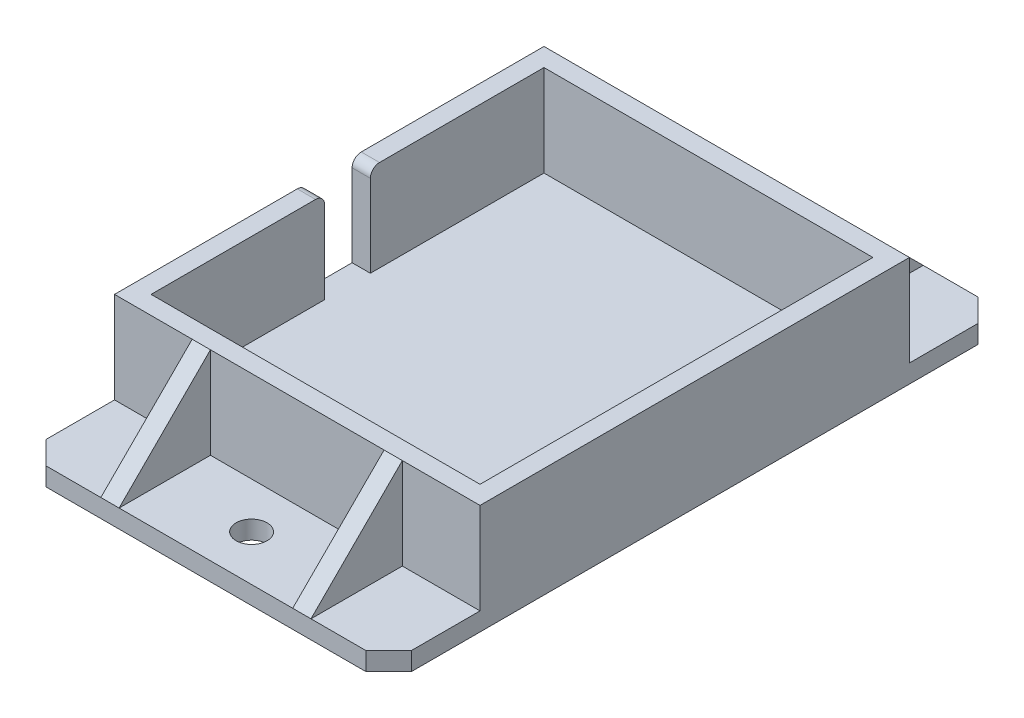
ISO-10303-21;
HEADER;
FILE_DESCRIPTION(('STEP AP214'),'2;1');
FILE_NAME('part.step','',(''),(''),'','','');
FILE_SCHEMA(('AUTOMOTIVE_DESIGN { 1 0 10303 214 1 1 1 1 }'));
ENDSEC;
DATA;
#1=APPLICATION_CONTEXT('core data for automotive mechanical design processes');
#2=APPLICATION_PROTOCOL_DEFINITION('international standard','automotive_design',2000,#1);
#3=PRODUCT_CONTEXT('',#1,'mechanical');
#4=PRODUCT('Part','Part','',(#3));
#5=PRODUCT_RELATED_PRODUCT_CATEGORY('part','',(#4));
#6=PRODUCT_DEFINITION_FORMATION('','',#4);
#7=PRODUCT_DEFINITION_CONTEXT('part definition',#1,'design');
#8=PRODUCT_DEFINITION('design','',#6,#7);
#9=PRODUCT_DEFINITION_SHAPE('','',#8);
#10=(LENGTH_UNIT() NAMED_UNIT(*) SI_UNIT(.MILLI.,.METRE.));
#11=(NAMED_UNIT(*) PLANE_ANGLE_UNIT() SI_UNIT($,.RADIAN.));
#12=(NAMED_UNIT(*) SI_UNIT($,.STERADIAN.) SOLID_ANGLE_UNIT());
#13=UNCERTAINTY_MEASURE_WITH_UNIT(LENGTH_MEASURE(1.E-05),#10,'distance_accuracy_value','');
#14=(GEOMETRIC_REPRESENTATION_CONTEXT(3) GLOBAL_UNCERTAINTY_ASSIGNED_CONTEXT((#13)) GLOBAL_UNIT_ASSIGNED_CONTEXT((#10,
#11,#12)) REPRESENTATION_CONTEXT('',''));
#15=CARTESIAN_POINT('',(0.,0.,0.));
#16=DIRECTION('',(0.,0.,1.));
#17=DIRECTION('',(1.,0.,0.));
#18=AXIS2_PLACEMENT_3D('',#15,#16,#17);
#19=CARTESIAN_POINT('',(-40.,20.,47.));
#20=DIRECTION('',(0.,0.,-1.));
#21=DIRECTION('',(-1.,0.,0.));
#22=AXIS2_PLACEMENT_3D('',#19,#20,#21);
#23=PLANE('',#22);
#24=DIRECTION('',(0.,-1.,0.));
#25=VECTOR('',#24,1.);
#26=CARTESIAN_POINT('',(19.,20.,47.));
#27=LINE('',#26,#25);
#28=CARTESIAN_POINT('',(19.,20.,47.));
#29=VERTEX_POINT('',#28);
#30=CARTESIAN_POINT('',(19.,0.,47.));
#31=VERTEX_POINT('',#30);
#32=EDGE_CURVE('E272',#29,#31,#27,.T.);
#33=ORIENTED_EDGE('',*,*,#32,.F.);
#34=DIRECTION('',(1.,0.,0.));
#35=VECTOR('',#34,1.);
#36=CARTESIAN_POINT('',(-40.,20.,47.));
#37=LINE('',#36,#35);
#38=CARTESIAN_POINT('',(-19.,20.,47.));
#39=VERTEX_POINT('',#38);
#40=EDGE_CURVE('E281',#39,#29,#37,.T.);
#41=ORIENTED_EDGE('',*,*,#40,.F.);
#42=DIRECTION('',(0.,1.,0.));
#43=VECTOR('',#42,1.);
#44=CARTESIAN_POINT('',(-19.,20.,47.));
#45=LINE('',#44,#43);
#46=CARTESIAN_POINT('',(-19.,0.,47.));
#47=VERTEX_POINT('',#46);
#48=EDGE_CURVE('E598',#47,#39,#45,.T.);
#49=ORIENTED_EDGE('',*,*,#48,.F.);
#50=DIRECTION('',(1.,0.,0.));
#51=VECTOR('',#50,1.);
#52=CARTESIAN_POINT('',(-40.,0.,47.));
#53=LINE('',#52,#51);
#54=EDGE_CURVE('E284',#47,#31,#53,.T.);
#55=ORIENTED_EDGE('',*,*,#54,.T.);
#56=EDGE_LOOP('',(#33,#41,#49,#55));
#57=FACE_BOUND('',#56,.T.);
#58=ADVANCED_FACE('F34',(#57),#23,.F.);
#59=CARTESIAN_POINT('',(0.,0.,0.));
#60=DIRECTION('',(0.,1.,0.));
#61=DIRECTION('',(0.,0.,1.));
#62=AXIS2_PLACEMENT_3D('',#59,#60,#61);
#63=PLANE('',#62);
#64=CARTESIAN_POINT('',(0.,0.,57.));
#65=DIRECTION('',(0.,1.,0.));
#66=DIRECTION('',(0.,0.,1.));
#67=AXIS2_PLACEMENT_3D('',#64,#65,#66);
#68=CIRCLE('',#67,3.4);
#69=CARTESIAN_POINT('',(0.,0.,60.4));
#70=VERTEX_POINT('',#69);
#71=EDGE_CURVE('E505',#70,#70,#68,.T.);
#72=ORIENTED_EDGE('',*,*,#71,.F.);
#73=EDGE_LOOP('',(#72));
#74=FACE_BOUND('',#73,.T.);
#75=DIRECTION('',(-1.,0.,0.));
#76=VECTOR('',#75,1.);
#77=CARTESIAN_POINT('',(-40.,0.,67.));
#78=LINE('',#77,#76);
#79=CARTESIAN_POINT('',(19.,0.,67.));
#80=VERTEX_POINT('',#79);
#81=CARTESIAN_POINT('',(-19.,0.,67.));
#82=VERTEX_POINT('',#81);
#83=EDGE_CURVE('E417',#80,#82,#78,.T.);
#84=ORIENTED_EDGE('',*,*,#83,.F.);
#85=DIRECTION('',(0.,0.,-1.));
#86=VECTOR('',#85,1.);
#87=CARTESIAN_POINT('',(19.,0.,0.));
#88=LINE('',#87,#86);
#89=EDGE_CURVE('E274',#80,#31,#88,.T.);
#90=ORIENTED_EDGE('',*,*,#89,.T.);
#91=ORIENTED_EDGE('',*,*,#54,.F.);
#92=DIRECTION('',(0.,0.,1.));
#93=VECTOR('',#92,1.);
#94=CARTESIAN_POINT('',(-19.,0.,0.));
#95=LINE('',#94,#93);
#96=EDGE_CURVE('E600',#47,#82,#95,.T.);
#97=ORIENTED_EDGE('',*,*,#96,.T.);
#98=EDGE_LOOP('',(#84,#90,#91,#97));
#99=FACE_BOUND('',#98,.T.);
#100=ADVANCED_FACE('F612',(#74,#99),#63,.T.);
#101=CARTESIAN_POINT('',(23.,20.,47.));
#102=VERTEX_POINT('',#101);
#103=CARTESIAN_POINT('',(40.,20.,47.));
#104=VERTEX_POINT('',#103);
#105=EDGE_CURVE('E292',#102,#104,#37,.T.);
#106=ORIENTED_EDGE('',*,*,#105,.F.);
#107=DIRECTION('',(0.,-1.,0.));
#108=VECTOR('',#107,1.);
#109=CARTESIAN_POINT('',(23.,20.,47.));
#110=LINE('',#109,#108);
#111=CARTESIAN_POINT('',(23.,0.,47.));
#112=VERTEX_POINT('',#111);
#113=EDGE_CURVE('E267',#102,#112,#110,.T.);
#114=ORIENTED_EDGE('',*,*,#113,.T.);
#115=CARTESIAN_POINT('',(40.,0.,47.));
#116=VERTEX_POINT('',#115);
#117=EDGE_CURVE('E310',#112,#116,#53,.T.);
#118=ORIENTED_EDGE('',*,*,#117,.T.);
#119=DIRECTION('',(0.,-1.,0.));
#120=VECTOR('',#119,1.);
#121=CARTESIAN_POINT('',(40.,20.,47.));
#122=LINE('',#121,#120);
#123=EDGE_CURVE('E321',#104,#116,#122,.T.);
#124=ORIENTED_EDGE('',*,*,#123,.F.);
#125=EDGE_LOOP('',(#106,#114,#118,#124));
#126=FACE_BOUND('',#125,.T.);
#127=ADVANCED_FACE('F461',(#126),#23,.F.);
#128=CARTESIAN_POINT('',(35.,0.,67.));
#129=VERTEX_POINT('',#128);
#130=CARTESIAN_POINT('',(23.,0.,67.));
#131=VERTEX_POINT('',#130);
#132=EDGE_CURVE('E414',#129,#131,#78,.T.);
#133=ORIENTED_EDGE('',*,*,#132,.F.);
#134=DIRECTION('',(-0.707106781186547,0.,0.707106781186549));
#135=VECTOR('',#134,1.);
#136=CARTESIAN_POINT('',(51.0000000000001,0.,50.9999999999999));
#137=LINE('',#136,#135);
#138=CARTESIAN_POINT('',(40.,0.,62.));
#139=VERTEX_POINT('',#138);
#140=EDGE_CURVE('E350',#129,#139,#137,.F.);
#141=ORIENTED_EDGE('',*,*,#140,.T.);
#142=DIRECTION('',(0.,0.,1.));
#143=VECTOR('',#142,1.);
#144=CARTESIAN_POINT('',(40.,0.,-67.));
#145=LINE('',#144,#143);
#146=EDGE_CURVE('E406',#116,#139,#145,.T.);
#147=ORIENTED_EDGE('',*,*,#146,.F.);
#148=ORIENTED_EDGE('',*,*,#117,.F.);
#149=DIRECTION('',(0.,0.,-1.));
#150=VECTOR('',#149,1.);
#151=CARTESIAN_POINT('',(23.,0.,0.));
#152=LINE('',#151,#150);
#153=EDGE_CURVE('E285',#131,#112,#152,.T.);
#154=ORIENTED_EDGE('',*,*,#153,.F.);
#155=EDGE_LOOP('',(#133,#141,#147,#148,#154));
#156=FACE_BOUND('',#155,.T.);
#157=ADVANCED_FACE('F466',(#156),#63,.T.);
#158=CARTESIAN_POINT('',(-40.,20.,-47.));
#159=DIRECTION('',(0.,0.,1.));
#160=DIRECTION('',(1.,0.,0.));
#161=AXIS2_PLACEMENT_3D('',#158,#159,#160);
#162=PLANE('',#161);
#163=DIRECTION('',(0.,1.,0.));
#164=VECTOR('',#163,1.);
#165=CARTESIAN_POINT('',(19.,20.,-47.));
#166=LINE('',#165,#164);
#167=CARTESIAN_POINT('',(19.,0.,-47.));
#168=VERTEX_POINT('',#167);
#169=CARTESIAN_POINT('',(19.,20.,-47.));
#170=VERTEX_POINT('',#169);
#171=EDGE_CURVE('E482',#168,#170,#166,.T.);
#172=ORIENTED_EDGE('',*,*,#171,.F.);
#173=DIRECTION('',(-1.,0.,0.));
#174=VECTOR('',#173,1.);
#175=CARTESIAN_POINT('',(-40.,0.,-47.));
#176=LINE('',#175,#174);
#177=CARTESIAN_POINT('',(-19.,0.,-47.));
#178=VERTEX_POINT('',#177);
#179=EDGE_CURVE('E315',#168,#178,#176,.T.);
#180=ORIENTED_EDGE('',*,*,#179,.T.);
#181=DIRECTION('',(0.,-1.,0.));
#182=VECTOR('',#181,1.);
#183=CARTESIAN_POINT('',(-19.,20.,-47.));
#184=LINE('',#183,#182);
#185=CARTESIAN_POINT('',(-19.,20.,-47.));
#186=VERTEX_POINT('',#185);
#187=EDGE_CURVE('E494',#186,#178,#184,.T.);
#188=ORIENTED_EDGE('',*,*,#187,.F.);
#189=DIRECTION('',(-1.,0.,0.));
#190=VECTOR('',#189,1.);
#191=CARTESIAN_POINT('',(-40.,20.,-47.));
#192=LINE('',#191,#190);
#193=EDGE_CURVE('E305',#170,#186,#192,.T.);
#194=ORIENTED_EDGE('',*,*,#193,.F.);
#195=EDGE_LOOP('',(#172,#180,#188,#194));
#196=FACE_BOUND('',#195,.T.);
#197=ADVANCED_FACE('F570',(#196),#162,.F.);
#198=CARTESIAN_POINT('',(0.,0.,-57.));
#199=DIRECTION('',(0.,1.,0.));
#200=DIRECTION('',(0.,0.,1.));
#201=AXIS2_PLACEMENT_3D('',#198,#199,#200);
#202=CIRCLE('',#201,3.4);
#203=CARTESIAN_POINT('',(0.,0.,-53.6));
#204=VERTEX_POINT('',#203);
#205=EDGE_CURVE('E511',#204,#204,#202,.T.);
#206=ORIENTED_EDGE('',*,*,#205,.F.);
#207=EDGE_LOOP('',(#206));
#208=FACE_BOUND('',#207,.T.);
#209=ORIENTED_EDGE('',*,*,#179,.F.);
#210=DIRECTION('',(0.,0.,-1.));
#211=VECTOR('',#210,1.);
#212=CARTESIAN_POINT('',(19.,0.,0.));
#213=LINE('',#212,#211);
#214=CARTESIAN_POINT('',(19.,0.,-67.));
#215=VERTEX_POINT('',#214);
#216=EDGE_CURVE('E575',#168,#215,#213,.T.);
#217=ORIENTED_EDGE('',*,*,#216,.T.);
#218=DIRECTION('',(1.,0.,0.));
#219=VECTOR('',#218,1.);
#220=CARTESIAN_POINT('',(-40.,0.,-67.));
#221=LINE('',#220,#219);
#222=CARTESIAN_POINT('',(-19.,0.,-67.));
#223=VERTEX_POINT('',#222);
#224=EDGE_CURVE('E577',#223,#215,#221,.T.);
#225=ORIENTED_EDGE('',*,*,#224,.F.);
#226=DIRECTION('',(0.,0.,1.));
#227=VECTOR('',#226,1.);
#228=CARTESIAN_POINT('',(-19.,0.,0.));
#229=LINE('',#228,#227);
#230=EDGE_CURVE('E489',#223,#178,#229,.T.);
#231=ORIENTED_EDGE('',*,*,#230,.T.);
#232=EDGE_LOOP('',(#209,#217,#225,#231));
#233=FACE_BOUND('',#232,.T.);
#234=ADVANCED_FACE('F574',(#208,#233),#63,.T.);
#235=CARTESIAN_POINT('',(40.,0.,-47.));
#236=VERTEX_POINT('',#235);
#237=CARTESIAN_POINT('',(23.,0.,-47.));
#238=VERTEX_POINT('',#237);
#239=EDGE_CURVE('E311',#236,#238,#176,.T.);
#240=ORIENTED_EDGE('',*,*,#239,.T.);
#241=DIRECTION('',(0.,1.,0.));
#242=VECTOR('',#241,1.);
#243=CARTESIAN_POINT('',(23.,20.,-47.));
#244=LINE('',#243,#242);
#245=CARTESIAN_POINT('',(23.,20.,-47.));
#246=VERTEX_POINT('',#245);
#247=EDGE_CURVE('E474',#238,#246,#244,.T.);
#248=ORIENTED_EDGE('',*,*,#247,.T.);
#249=CARTESIAN_POINT('',(40.,20.,-47.));
#250=VERTEX_POINT('',#249);
#251=EDGE_CURVE('E301',#250,#246,#192,.T.);
#252=ORIENTED_EDGE('',*,*,#251,.F.);
#253=DIRECTION('',(0.,-1.,0.));
#254=VECTOR('',#253,1.);
#255=CARTESIAN_POINT('',(40.,20.,-47.));
#256=LINE('',#255,#254);
#257=EDGE_CURVE('E318',#250,#236,#256,.T.);
#258=ORIENTED_EDGE('',*,*,#257,.T.);
#259=EDGE_LOOP('',(#240,#248,#252,#258));
#260=FACE_BOUND('',#259,.T.);
#261=ADVANCED_FACE('F473',(#260),#162,.F.);
#262=CARTESIAN_POINT('',(40.,0.,-62.));
#263=VERTEX_POINT('',#262);
#264=EDGE_CURVE('E400',#263,#236,#145,.T.);
#265=ORIENTED_EDGE('',*,*,#264,.F.);
#266=DIRECTION('',(0.707106781186549,0.,0.707106781186547));
#267=VECTOR('',#266,1.);
#268=CARTESIAN_POINT('',(51.,0.,-51.0000000000001));
#269=LINE('',#268,#267);
#270=CARTESIAN_POINT('',(35.,0.,-67.));
#271=VERTEX_POINT('',#270);
#272=EDGE_CURVE('E55',#263,#271,#269,.F.);
#273=ORIENTED_EDGE('',*,*,#272,.T.);
#274=CARTESIAN_POINT('',(23.,0.,-67.));
#275=VERTEX_POINT('',#274);
#276=EDGE_CURVE('E381',#275,#271,#221,.T.);
#277=ORIENTED_EDGE('',*,*,#276,.F.);
#278=DIRECTION('',(0.,0.,-1.));
#279=VECTOR('',#278,1.);
#280=CARTESIAN_POINT('',(23.,0.,0.));
#281=LINE('',#280,#279);
#282=EDGE_CURVE('E478',#238,#275,#281,.T.);
#283=ORIENTED_EDGE('',*,*,#282,.F.);
#284=ORIENTED_EDGE('',*,*,#239,.F.);
#285=EDGE_LOOP('',(#265,#273,#277,#283,#284));
#286=FACE_BOUND('',#285,.T.);
#287=ADVANCED_FACE('F403',(#286),#63,.T.);
#288=CARTESIAN_POINT('',(-36.,20.,-43.));
#289=DIRECTION('',(1.,0.,0.));
#290=DIRECTION('',(0.,0.,-1.));
#291=AXIS2_PLACEMENT_3D('',#288,#289,#290);
#292=PLANE('',#291);
#293=DIRECTION('',(0.,0.,1.));
#294=VECTOR('',#293,1.);
#295=CARTESIAN_POINT('',(-36.,20.,-43.));
#296=LINE('',#295,#294);
#297=CARTESIAN_POINT('',(-36.,20.,-43.));
#298=VERTEX_POINT('',#297);
#299=CARTESIAN_POINT('',(-36.,20.,-6.99999999999999));
#300=VERTEX_POINT('',#299);
#301=EDGE_CURVE('E429',#298,#300,#296,.T.);
#302=ORIENTED_EDGE('',*,*,#301,.T.);
#303=CARTESIAN_POINT('',(-36.,18.,-6.99999999999999));
#304=DIRECTION('',(1.,0.,0.));
#305=DIRECTION('',(0.,0.,-1.));
#306=AXIS2_PLACEMENT_3D('',#303,#304,#305);
#307=CIRCLE('',#306,2.);
#308=CARTESIAN_POINT('',(-36.,18.,-4.99999999999999));
#309=VERTEX_POINT('',#308);
#310=EDGE_CURVE('E339',#300,#309,#307,.T.);
#311=ORIENTED_EDGE('',*,*,#310,.T.);
#312=DIRECTION('',(0.,-1.,0.));
#313=VECTOR('',#312,1.);
#314=CARTESIAN_POINT('',(-36.,0.,-4.99999999999999));
#315=LINE('',#314,#313);
#316=CARTESIAN_POINT('',(-36.,0.,-4.99999999999999));
#317=VERTEX_POINT('',#316);
#318=EDGE_CURVE('E412',#309,#317,#315,.T.);
#319=ORIENTED_EDGE('',*,*,#318,.T.);
#320=DIRECTION('',(0.,0.,1.));
#321=VECTOR('',#320,1.);
#322=CARTESIAN_POINT('',(-36.,0.,-43.));
#323=LINE('',#322,#321);
#324=CARTESIAN_POINT('',(-36.,0.,-43.));
#325=VERTEX_POINT('',#324);
#326=EDGE_CURVE('E440',#325,#317,#323,.T.);
#327=ORIENTED_EDGE('',*,*,#326,.F.);
#328=DIRECTION('',(0.,-1.,0.));
#329=VECTOR('',#328,1.);
#330=CARTESIAN_POINT('',(-36.,20.,-43.));
#331=LINE('',#330,#329);
#332=EDGE_CURVE('E449',#298,#325,#331,.T.);
#333=ORIENTED_EDGE('',*,*,#332,.F.);
#334=EDGE_LOOP('',(#302,#311,#319,#327,#333));
#335=FACE_BOUND('',#334,.T.);
#336=ADVANCED_FACE('F721',(#335),#292,.T.);
#337=CARTESIAN_POINT('',(0.,20.,0.));
#338=DIRECTION('',(0.,1.,0.));
#339=DIRECTION('',(0.,0.,1.));
#340=AXIS2_PLACEMENT_3D('',#337,#338,#339);
#341=PLANE('',#340);
#342=DIRECTION('',(0.,0.,-1.));
#343=VECTOR('',#342,1.);
#344=CARTESIAN_POINT('',(36.,20.,-43.));
#345=LINE('',#344,#343);
#346=CARTESIAN_POINT('',(36.,20.,43.));
#347=VERTEX_POINT('',#346);
#348=CARTESIAN_POINT('',(36.,20.,-43.));
#349=VERTEX_POINT('',#348);
#350=EDGE_CURVE('E423',#347,#349,#345,.T.);
#351=ORIENTED_EDGE('',*,*,#350,.F.);
#352=DIRECTION('',(1.,0.,0.));
#353=VECTOR('',#352,1.);
#354=CARTESIAN_POINT('',(-36.,20.,43.));
#355=LINE('',#354,#353);
#356=CARTESIAN_POINT('',(-36.,20.,43.));
#357=VERTEX_POINT('',#356);
#358=EDGE_CURVE('E432',#357,#347,#355,.T.);
#359=ORIENTED_EDGE('',*,*,#358,.F.);
#360=CARTESIAN_POINT('',(-36.,20.,7.00000000000001));
#361=VERTEX_POINT('',#360);
#362=EDGE_CURVE('E428',#361,#357,#296,.T.);
#363=ORIENTED_EDGE('',*,*,#362,.F.);
#364=DIRECTION('',(-1.,0.,0.));
#365=VECTOR('',#364,1.);
#366=CARTESIAN_POINT('',(-40.,20.,7.));
#367=LINE('',#366,#365);
#368=CARTESIAN_POINT('',(-40.,20.,7.00000000000001));
#369=VERTEX_POINT('',#368);
#370=EDGE_CURVE('E334',#361,#369,#367,.T.);
#371=ORIENTED_EDGE('',*,*,#370,.T.);
#372=DIRECTION('',(0.,0.,1.));
#373=VECTOR('',#372,1.);
#374=CARTESIAN_POINT('',(-40.,20.,-47.));
#375=LINE('',#374,#373);
#376=CARTESIAN_POINT('',(-40.,20.,47.));
#377=VERTEX_POINT('',#376);
#378=EDGE_CURVE('E314',#369,#377,#375,.T.);
#379=ORIENTED_EDGE('',*,*,#378,.T.);
#380=CARTESIAN_POINT('',(-23.,20.,47.));
#381=VERTEX_POINT('',#380);
#382=EDGE_CURVE('E291',#377,#381,#37,.T.);
#383=ORIENTED_EDGE('',*,*,#382,.T.);
#384=DIRECTION('',(1.,0.,0.));
#385=VECTOR('',#384,1.);
#386=CARTESIAN_POINT('',(-40.,20.,47.));
#387=LINE('',#386,#385);
#388=EDGE_CURVE('E290',#381,#39,#387,.T.);
#389=ORIENTED_EDGE('',*,*,#388,.T.);
#390=ORIENTED_EDGE('',*,*,#40,.T.);
#391=DIRECTION('',(-1.,0.,0.));
#392=VECTOR('',#391,1.);
#393=CARTESIAN_POINT('',(0.,20.,47.));
#394=LINE('',#393,#392);
#395=EDGE_CURVE('E255',#29,#102,#394,.F.);
#396=ORIENTED_EDGE('',*,*,#395,.T.);
#397=ORIENTED_EDGE('',*,*,#105,.T.);
#398=DIRECTION('',(0.,0.,-1.));
#399=VECTOR('',#398,1.);
#400=CARTESIAN_POINT('',(40.,20.,-47.));
#401=LINE('',#400,#399);
#402=EDGE_CURVE('E294',#104,#250,#401,.T.);
#403=ORIENTED_EDGE('',*,*,#402,.T.);
#404=ORIENTED_EDGE('',*,*,#251,.T.);
#405=DIRECTION('',(-1.,0.,0.));
#406=VECTOR('',#405,1.);
#407=CARTESIAN_POINT('',(0.,20.,-47.));
#408=LINE('',#407,#406);
#409=EDGE_CURVE('E470',#246,#170,#408,.T.);
#410=ORIENTED_EDGE('',*,*,#409,.T.);
#411=ORIENTED_EDGE('',*,*,#193,.T.);
#412=DIRECTION('',(1.,0.,0.));
#413=VECTOR('',#412,1.);
#414=CARTESIAN_POINT('',(-40.,20.,-47.));
#415=LINE('',#414,#413);
#416=CARTESIAN_POINT('',(-23.,20.,-47.));
#417=VERTEX_POINT('',#416);
#418=EDGE_CURVE('E502',#186,#417,#415,.F.);
#419=ORIENTED_EDGE('',*,*,#418,.T.);
#420=CARTESIAN_POINT('',(-40.,20.,-47.));
#421=VERTEX_POINT('',#420);
#422=EDGE_CURVE('E300',#417,#421,#192,.T.);
#423=ORIENTED_EDGE('',*,*,#422,.T.);
#424=CARTESIAN_POINT('',(-40.,20.,-6.99999999999999));
#425=VERTEX_POINT('',#424);
#426=EDGE_CURVE('E295',#421,#425,#375,.T.);
#427=ORIENTED_EDGE('',*,*,#426,.T.);
#428=DIRECTION('',(-1.,0.,0.));
#429=VECTOR('',#428,1.);
#430=CARTESIAN_POINT('',(-36.,20.,-6.99999999999999));
#431=LINE('',#430,#429);
#432=EDGE_CURVE('E337',#425,#300,#431,.F.);
#433=ORIENTED_EDGE('',*,*,#432,.T.);
#434=ORIENTED_EDGE('',*,*,#301,.F.);
#435=DIRECTION('',(-1.,0.,0.));
#436=VECTOR('',#435,1.);
#437=CARTESIAN_POINT('',(-36.,20.,-43.));
#438=LINE('',#437,#436);
#439=EDGE_CURVE('E425',#349,#298,#438,.T.);
#440=ORIENTED_EDGE('',*,*,#439,.F.);
#441=EDGE_LOOP('',(#351,#359,#363,#371,#379,#383,#389,#390,#396,#397,#403,#404,#410,#411,#419,
#423,#427,#433,#434,#440));
#442=FACE_BOUND('',#441,.T.);
#443=ADVANCED_FACE('F288',(#442),#341,.T.);
#444=CARTESIAN_POINT('',(-40.,20.,-47.));
#445=DIRECTION('',(1.,0.,0.));
#446=DIRECTION('',(0.,0.,-1.));
#447=AXIS2_PLACEMENT_3D('',#444,#445,#446);
#448=PLANE('',#447);
#449=DIRECTION('',(0.,0.,-1.));
#450=VECTOR('',#449,1.);
#451=CARTESIAN_POINT('',(-40.,-4.,-67.));
#452=LINE('',#451,#450);
#453=CARTESIAN_POINT('',(-40.,-4.,62.));
#454=VERTEX_POINT('',#453);
#455=CARTESIAN_POINT('',(-40.,-4.,-62.));
#456=VERTEX_POINT('',#455);
#457=EDGE_CURVE('E392',#454,#456,#452,.T.);
#458=ORIENTED_EDGE('',*,*,#457,.F.);
#459=DIRECTION('',(0.,1.,0.));
#460=VECTOR('',#459,1.);
#461=CARTESIAN_POINT('',(-40.,20.,62.));
#462=LINE('',#461,#460);
#463=CARTESIAN_POINT('',(-40.,0.,62.));
#464=VERTEX_POINT('',#463);
#465=EDGE_CURVE('E367',#454,#464,#462,.T.);
#466=ORIENTED_EDGE('',*,*,#465,.T.);
#467=DIRECTION('',(0.,0.,-1.));
#468=VECTOR('',#467,1.);
#469=CARTESIAN_POINT('',(-40.,0.,-67.));
#470=LINE('',#469,#468);
#471=CARTESIAN_POINT('',(-40.,0.,47.));
#472=VERTEX_POINT('',#471);
#473=EDGE_CURVE('E418',#464,#472,#470,.T.);
#474=ORIENTED_EDGE('',*,*,#473,.T.);
#475=DIRECTION('',(0.,-1.,0.));
#476=VECTOR('',#475,1.);
#477=CARTESIAN_POINT('',(-40.,20.,47.));
#478=LINE('',#477,#476);
#479=EDGE_CURVE('E324',#377,#472,#478,.T.);
#480=ORIENTED_EDGE('',*,*,#479,.F.);
#481=ORIENTED_EDGE('',*,*,#378,.F.);
#482=CARTESIAN_POINT('',(-40.,18.,7.));
#483=DIRECTION('',(1.,0.,0.));
#484=DIRECTION('',(0.,0.,-1.));
#485=AXIS2_PLACEMENT_3D('',#482,#483,#484);
#486=CIRCLE('',#485,2.);
#487=CARTESIAN_POINT('',(-40.,18.,5.));
#488=VERTEX_POINT('',#487);
#489=EDGE_CURVE('E330',#369,#488,#486,.F.);
#490=ORIENTED_EDGE('',*,*,#489,.T.);
#491=DIRECTION('',(0.,1.,0.));
#492=VECTOR('',#491,1.);
#493=CARTESIAN_POINT('',(-40.,20.,5.));
#494=LINE('',#493,#492);
#495=CARTESIAN_POINT('',(-40.,0.,5.00000000000001));
#496=VERTEX_POINT('',#495);
#497=EDGE_CURVE('E525',#496,#488,#494,.T.);
#498=ORIENTED_EDGE('',*,*,#497,.F.);
#499=DIRECTION('',(0.,0.,1.));
#500=VECTOR('',#499,1.);
#501=CARTESIAN_POINT('',(-40.,0.,5.00000000000001));
#502=LINE('',#501,#500);
#503=CARTESIAN_POINT('',(-40.,0.,-4.99999999999999));
#504=VERTEX_POINT('',#503);
#505=EDGE_CURVE('E522',#504,#496,#502,.T.);
#506=ORIENTED_EDGE('',*,*,#505,.F.);
#507=DIRECTION('',(0.,-1.,0.));
#508=VECTOR('',#507,1.);
#509=CARTESIAN_POINT('',(-40.,0.,-4.99999999999999));
#510=LINE('',#509,#508);
#511=CARTESIAN_POINT('',(-40.,18.,-4.99999999999999));
#512=VERTEX_POINT('',#511);
#513=EDGE_CURVE('E520',#512,#504,#510,.T.);
#514=ORIENTED_EDGE('',*,*,#513,.F.);
#515=CARTESIAN_POINT('',(-40.,18.,-6.99999999999999));
#516=DIRECTION('',(1.,0.,0.));
#517=DIRECTION('',(0.,0.,-1.));
#518=AXIS2_PLACEMENT_3D('',#515,#516,#517);
#519=CIRCLE('',#518,2.);
#520=EDGE_CURVE('E332',#512,#425,#519,.F.);
#521=ORIENTED_EDGE('',*,*,#520,.T.);
#522=ORIENTED_EDGE('',*,*,#426,.F.);
#523=DIRECTION('',(0.,-1.,0.));
#524=VECTOR('',#523,1.);
#525=CARTESIAN_POINT('',(-40.,20.,-47.));
#526=LINE('',#525,#524);
#527=CARTESIAN_POINT('',(-40.,0.,-47.));
#528=VERTEX_POINT('',#527);
#529=EDGE_CURVE('E304',#421,#528,#526,.T.);
#530=ORIENTED_EDGE('',*,*,#529,.T.);
#531=CARTESIAN_POINT('',(-40.,0.,-62.));
#532=VERTEX_POINT('',#531);
#533=EDGE_CURVE('E416',#528,#532,#470,.T.);
#534=ORIENTED_EDGE('',*,*,#533,.T.);
#535=DIRECTION('',(0.,-1.,0.));
#536=VECTOR('',#535,1.);
#537=CARTESIAN_POINT('',(-40.,20.,-62.));
#538=LINE('',#537,#536);
#539=EDGE_CURVE('E365',#532,#456,#538,.T.);
#540=ORIENTED_EDGE('',*,*,#539,.T.);
#541=EDGE_LOOP('',(#458,#466,#474,#480,#481,#490,#498,#506,#514,#521,#522,#530,#534,#540));
#542=FACE_BOUND('',#541,.T.);
#543=ADVANCED_FACE('F644',(#542),#448,.F.);
#544=CARTESIAN_POINT('',(-23.,0.,47.));
#545=VERTEX_POINT('',#544);
#546=EDGE_CURVE('E306',#472,#545,#53,.T.);
#547=ORIENTED_EDGE('',*,*,#546,.T.);
#548=DIRECTION('',(0.,1.,0.));
#549=VECTOR('',#548,1.);
#550=CARTESIAN_POINT('',(-23.,20.,47.));
#551=LINE('',#550,#549);
#552=EDGE_CURVE('E589',#545,#381,#551,.T.);
#553=ORIENTED_EDGE('',*,*,#552,.T.);
#554=ORIENTED_EDGE('',*,*,#382,.F.);
#555=ORIENTED_EDGE('',*,*,#479,.T.);
#556=EDGE_LOOP('',(#547,#553,#554,#555));
#557=FACE_BOUND('',#556,.T.);
#558=ADVANCED_FACE('F633',(#557),#23,.F.);
#559=CARTESIAN_POINT('',(40.,20.,-47.));
#560=DIRECTION('',(-1.,0.,0.));
#561=DIRECTION('',(0.,0.,1.));
#562=AXIS2_PLACEMENT_3D('',#559,#560,#561);
#563=PLANE('',#562);
#564=ORIENTED_EDGE('',*,*,#146,.T.);
#565=DIRECTION('',(0.,-1.,0.));
#566=VECTOR('',#565,1.);
#567=CARTESIAN_POINT('',(40.,20.,62.));
#568=LINE('',#567,#566);
#569=CARTESIAN_POINT('',(40.,-4.,62.));
#570=VERTEX_POINT('',#569);
#571=EDGE_CURVE('E355',#139,#570,#568,.T.);
#572=ORIENTED_EDGE('',*,*,#571,.T.);
#573=DIRECTION('',(0.,0.,1.));
#574=VECTOR('',#573,1.);
#575=CARTESIAN_POINT('',(40.,-4.,-67.));
#576=LINE('',#575,#574);
#577=CARTESIAN_POINT('',(40.,-4.,-62.));
#578=VERTEX_POINT('',#577);
#579=EDGE_CURVE('E402',#578,#570,#576,.T.);
#580=ORIENTED_EDGE('',*,*,#579,.F.);
#581=DIRECTION('',(0.,1.,0.));
#582=VECTOR('',#581,1.);
#583=CARTESIAN_POINT('',(40.,20.,-62.));
#584=LINE('',#583,#582);
#585=EDGE_CURVE('E352',#578,#263,#584,.T.);
#586=ORIENTED_EDGE('',*,*,#585,.T.);
#587=ORIENTED_EDGE('',*,*,#264,.T.);
#588=ORIENTED_EDGE('',*,*,#257,.F.);
#589=ORIENTED_EDGE('',*,*,#402,.F.);
#590=ORIENTED_EDGE('',*,*,#123,.T.);
#591=EDGE_LOOP('',(#564,#572,#580,#586,#587,#588,#589,#590));
#592=FACE_BOUND('',#591,.T.);
#593=ADVANCED_FACE('F398',(#592),#563,.F.);
#594=ORIENTED_EDGE('',*,*,#422,.F.);
#595=DIRECTION('',(0.,-1.,0.));
#596=VECTOR('',#595,1.);
#597=CARTESIAN_POINT('',(-23.,20.,-47.));
#598=LINE('',#597,#596);
#599=CARTESIAN_POINT('',(-23.,0.,-47.));
#600=VERTEX_POINT('',#599);
#601=EDGE_CURVE('E499',#417,#600,#598,.T.);
#602=ORIENTED_EDGE('',*,*,#601,.T.);
#603=EDGE_CURVE('E309',#600,#528,#176,.T.);
#604=ORIENTED_EDGE('',*,*,#603,.T.);
#605=ORIENTED_EDGE('',*,*,#529,.F.);
#606=EDGE_LOOP('',(#594,#602,#604,#605));
#607=FACE_BOUND('',#606,.T.);
#608=ADVANCED_FACE('F555',(#607),#162,.F.);
#609=CARTESIAN_POINT('',(36.,20.,-43.));
#610=DIRECTION('',(-1.,0.,0.));
#611=DIRECTION('',(0.,0.,1.));
#612=AXIS2_PLACEMENT_3D('',#609,#610,#611);
#613=PLANE('',#612);
#614=DIRECTION('',(0.,0.,-1.));
#615=VECTOR('',#614,1.);
#616=CARTESIAN_POINT('',(36.,0.,-43.));
#617=LINE('',#616,#615);
#618=CARTESIAN_POINT('',(36.,0.,43.));
#619=VERTEX_POINT('',#618);
#620=CARTESIAN_POINT('',(36.,0.,-43.));
#621=VERTEX_POINT('',#620);
#622=EDGE_CURVE('E391',#619,#621,#617,.T.);
#623=ORIENTED_EDGE('',*,*,#622,.F.);
#624=DIRECTION('',(0.,-1.,0.));
#625=VECTOR('',#624,1.);
#626=CARTESIAN_POINT('',(36.,20.,43.));
#627=LINE('',#626,#625);
#628=EDGE_CURVE('E434',#347,#619,#627,.T.);
#629=ORIENTED_EDGE('',*,*,#628,.F.);
#630=ORIENTED_EDGE('',*,*,#350,.T.);
#631=DIRECTION('',(0.,-1.,0.));
#632=VECTOR('',#631,1.);
#633=CARTESIAN_POINT('',(36.,20.,-43.));
#634=LINE('',#633,#632);
#635=EDGE_CURVE('E451',#349,#621,#634,.T.);
#636=ORIENTED_EDGE('',*,*,#635,.T.);
#637=EDGE_LOOP('',(#623,#629,#630,#636));
#638=FACE_BOUND('',#637,.T.);
#639=ADVANCED_FACE('F724',(#638),#613,.T.);
#640=CARTESIAN_POINT('',(-36.,20.,-43.));
#641=DIRECTION('',(0.,0.,1.));
#642=DIRECTION('',(1.,0.,0.));
#643=AXIS2_PLACEMENT_3D('',#640,#641,#642);
#644=PLANE('',#643);
#645=ORIENTED_EDGE('',*,*,#439,.T.);
#646=ORIENTED_EDGE('',*,*,#332,.T.);
#647=DIRECTION('',(-1.,0.,0.));
#648=VECTOR('',#647,1.);
#649=CARTESIAN_POINT('',(-36.,0.,-43.));
#650=LINE('',#649,#648);
#651=EDGE_CURVE('E437',#621,#325,#650,.T.);
#652=ORIENTED_EDGE('',*,*,#651,.F.);
#653=ORIENTED_EDGE('',*,*,#635,.F.);
#654=EDGE_LOOP('',(#645,#646,#652,#653));
#655=FACE_BOUND('',#654,.T.);
#656=ADVANCED_FACE('F719',(#655),#644,.T.);
#657=DIRECTION('',(0.,1.,0.));
#658=VECTOR('',#657,1.);
#659=CARTESIAN_POINT('',(-36.,20.,5.));
#660=LINE('',#659,#658);
#661=CARTESIAN_POINT('',(-36.,0.,5.00000000000001));
#662=VERTEX_POINT('',#661);
#663=CARTESIAN_POINT('',(-36.,18.,5.));
#664=VERTEX_POINT('',#663);
#665=EDGE_CURVE('E517',#662,#664,#660,.T.);
#666=ORIENTED_EDGE('',*,*,#665,.T.);
#667=CARTESIAN_POINT('',(-36.,18.,7.));
#668=DIRECTION('',(1.,0.,0.));
#669=DIRECTION('',(0.,0.,-1.));
#670=AXIS2_PLACEMENT_3D('',#667,#668,#669);
#671=CIRCLE('',#670,2.);
#672=EDGE_CURVE('E343',#664,#361,#671,.T.);
#673=ORIENTED_EDGE('',*,*,#672,.T.);
#674=ORIENTED_EDGE('',*,*,#362,.T.);
#675=DIRECTION('',(0.,-1.,0.));
#676=VECTOR('',#675,1.);
#677=CARTESIAN_POINT('',(-36.,20.,43.));
#678=LINE('',#677,#676);
#679=CARTESIAN_POINT('',(-36.,0.,43.));
#680=VERTEX_POINT('',#679);
#681=EDGE_CURVE('E446',#357,#680,#678,.T.);
#682=ORIENTED_EDGE('',*,*,#681,.T.);
#683=EDGE_CURVE('E439',#662,#680,#323,.T.);
#684=ORIENTED_EDGE('',*,*,#683,.F.);
#685=EDGE_LOOP('',(#666,#673,#674,#682,#684));
#686=FACE_BOUND('',#685,.T.);
#687=ADVANCED_FACE('F715',(#686),#292,.T.);
#688=CARTESIAN_POINT('',(-36.,20.,43.));
#689=DIRECTION('',(0.,0.,-1.));
#690=DIRECTION('',(-1.,0.,0.));
#691=AXIS2_PLACEMENT_3D('',#688,#689,#690);
#692=PLANE('',#691);
#693=ORIENTED_EDGE('',*,*,#628,.T.);
#694=DIRECTION('',(1.,0.,0.));
#695=VECTOR('',#694,1.);
#696=CARTESIAN_POINT('',(-36.,0.,43.));
#697=LINE('',#696,#695);
#698=EDGE_CURVE('E426',#680,#619,#697,.T.);
#699=ORIENTED_EDGE('',*,*,#698,.F.);
#700=ORIENTED_EDGE('',*,*,#681,.F.);
#701=ORIENTED_EDGE('',*,*,#358,.T.);
#702=EDGE_LOOP('',(#693,#699,#700,#701));
#703=FACE_BOUND('',#702,.T.);
#704=ADVANCED_FACE('F707',(#703),#692,.T.);
#705=ORIENTED_EDGE('',*,*,#651,.T.);
#706=ORIENTED_EDGE('',*,*,#326,.T.);
#707=DIRECTION('',(-1.,0.,0.));
#708=VECTOR('',#707,1.);
#709=CARTESIAN_POINT('',(40.001,0.,-5.));
#710=LINE('',#709,#708);
#711=EDGE_CURVE('E528',#317,#504,#710,.T.);
#712=ORIENTED_EDGE('',*,*,#711,.T.);
#713=ORIENTED_EDGE('',*,*,#505,.T.);
#714=DIRECTION('',(-1.,0.,0.));
#715=VECTOR('',#714,1.);
#716=CARTESIAN_POINT('',(40.001,0.,5.));
#717=LINE('',#716,#715);
#718=EDGE_CURVE('E529',#662,#496,#717,.T.);
#719=ORIENTED_EDGE('',*,*,#718,.F.);
#720=ORIENTED_EDGE('',*,*,#683,.T.);
#721=ORIENTED_EDGE('',*,*,#698,.T.);
#722=ORIENTED_EDGE('',*,*,#622,.T.);
#723=EDGE_LOOP('',(#705,#706,#712,#713,#719,#720,#721,#722));
#724=FACE_BOUND('',#723,.T.);
#725=ADVANCED_FACE('F639',(#724),#63,.T.);
#726=CARTESIAN_POINT('',(-35.,0.,-67.));
#727=VERTEX_POINT('',#726);
#728=CARTESIAN_POINT('',(-23.,0.,-67.));
#729=VERTEX_POINT('',#728);
#730=EDGE_CURVE('E420',#727,#729,#221,.T.);
#731=ORIENTED_EDGE('',*,*,#730,.F.);
#732=DIRECTION('',(0.707106781186547,0.,-0.707106781186548));
#733=VECTOR('',#732,1.);
#734=CARTESIAN_POINT('',(-51.,0.,-51.));
#735=LINE('',#734,#733);
#736=EDGE_CURVE('E11',#727,#532,#735,.F.);
#737=ORIENTED_EDGE('',*,*,#736,.T.);
#738=ORIENTED_EDGE('',*,*,#533,.F.);
#739=ORIENTED_EDGE('',*,*,#603,.F.);
#740=DIRECTION('',(0.,0.,1.));
#741=VECTOR('',#740,1.);
#742=CARTESIAN_POINT('',(-23.,0.,0.));
#743=LINE('',#742,#741);
#744=EDGE_CURVE('E497',#729,#600,#743,.T.);
#745=ORIENTED_EDGE('',*,*,#744,.F.);
#746=EDGE_LOOP('',(#731,#737,#738,#739,#745));
#747=FACE_BOUND('',#746,.T.);
#748=ADVANCED_FACE('F546',(#747),#63,.T.);
#749=ORIENTED_EDGE('',*,*,#473,.F.);
#750=DIRECTION('',(-0.707106781186549,0.,-0.707106781186546));
#751=VECTOR('',#750,1.);
#752=CARTESIAN_POINT('',(-50.9999999999999,0.,51.0000000000002));
#753=LINE('',#752,#751);
#754=CARTESIAN_POINT('',(-35.,0.,67.));
#755=VERTEX_POINT('',#754);
#756=EDGE_CURVE('E370',#464,#755,#753,.F.);
#757=ORIENTED_EDGE('',*,*,#756,.T.);
#758=CARTESIAN_POINT('',(-23.,0.,67.));
#759=VERTEX_POINT('',#758);
#760=EDGE_CURVE('E405',#759,#755,#78,.T.);
#761=ORIENTED_EDGE('',*,*,#760,.F.);
#762=DIRECTION('',(0.,0.,1.));
#763=VECTOR('',#762,1.);
#764=CARTESIAN_POINT('',(-23.,0.,0.));
#765=LINE('',#764,#763);
#766=EDGE_CURVE('E595',#545,#759,#765,.T.);
#767=ORIENTED_EDGE('',*,*,#766,.F.);
#768=ORIENTED_EDGE('',*,*,#546,.F.);
#769=EDGE_LOOP('',(#749,#757,#761,#767,#768));
#770=FACE_BOUND('',#769,.T.);
#771=ADVANCED_FACE('F656',(#770),#63,.T.);
#772=CARTESIAN_POINT('',(-40.,-4.,67.));
#773=DIRECTION('',(0.,0.,-1.));
#774=DIRECTION('',(-1.,0.,0.));
#775=AXIS2_PLACEMENT_3D('',#772,#773,#774);
#776=PLANE('',#775);
#777=DIRECTION('',(-1.,0.,0.));
#778=VECTOR('',#777,1.);
#779=CARTESIAN_POINT('',(-40.,-4.,67.));
#780=LINE('',#779,#778);
#781=CARTESIAN_POINT('',(35.,-4.,67.));
#782=VERTEX_POINT('',#781);
#783=CARTESIAN_POINT('',(-35.,-4.,67.));
#784=VERTEX_POINT('',#783);
#785=EDGE_CURVE('E535',#782,#784,#780,.T.);
#786=ORIENTED_EDGE('',*,*,#785,.F.);
#787=DIRECTION('',(0.,1.,0.));
#788=VECTOR('',#787,1.);
#789=CARTESIAN_POINT('',(35.,-4.,67.));
#790=LINE('',#789,#788);
#791=EDGE_CURVE('E347',#782,#129,#790,.T.);
#792=ORIENTED_EDGE('',*,*,#791,.T.);
#793=ORIENTED_EDGE('',*,*,#132,.T.);
#794=EDGE_CURVE('E411',#131,#80,#78,.T.);
#795=ORIENTED_EDGE('',*,*,#794,.T.);
#796=ORIENTED_EDGE('',*,*,#83,.T.);
#797=EDGE_CURVE('E409',#82,#759,#78,.T.);
#798=ORIENTED_EDGE('',*,*,#797,.T.);
#799=ORIENTED_EDGE('',*,*,#760,.T.);
#800=DIRECTION('',(0.,-1.,0.));
#801=VECTOR('',#800,1.);
#802=CARTESIAN_POINT('',(-35.,-4.,67.));
#803=LINE('',#802,#801);
#804=EDGE_CURVE('E345',#755,#784,#803,.T.);
#805=ORIENTED_EDGE('',*,*,#804,.T.);
#806=EDGE_LOOP('',(#786,#792,#793,#795,#796,#798,#799,#805));
#807=FACE_BOUND('',#806,.T.);
#808=ADVANCED_FACE('F618',(#807),#776,.F.);
#809=CARTESIAN_POINT('',(-40.,-4.,-67.));
#810=DIRECTION('',(0.,0.,1.));
#811=DIRECTION('',(1.,0.,0.));
#812=AXIS2_PLACEMENT_3D('',#809,#810,#811);
#813=PLANE('',#812);
#814=ORIENTED_EDGE('',*,*,#276,.T.);
#815=DIRECTION('',(0.,-1.,0.));
#816=VECTOR('',#815,1.);
#817=CARTESIAN_POINT('',(35.,-4.,-67.));
#818=LINE('',#817,#816);
#819=CARTESIAN_POINT('',(35.,-4.,-67.));
#820=VERTEX_POINT('',#819);
#821=EDGE_CURVE('E42',#271,#820,#818,.T.);
#822=ORIENTED_EDGE('',*,*,#821,.T.);
#823=DIRECTION('',(1.,0.,0.));
#824=VECTOR('',#823,1.);
#825=CARTESIAN_POINT('',(-40.,-4.,-67.));
#826=LINE('',#825,#824);
#827=CARTESIAN_POINT('',(-35.,-4.,-67.));
#828=VERTEX_POINT('',#827);
#829=EDGE_CURVE('E379',#828,#820,#826,.T.);
#830=ORIENTED_EDGE('',*,*,#829,.F.);
#831=DIRECTION('',(0.,1.,0.));
#832=VECTOR('',#831,1.);
#833=CARTESIAN_POINT('',(-35.,-4.,-67.));
#834=LINE('',#833,#832);
#835=EDGE_CURVE('E373',#828,#727,#834,.T.);
#836=ORIENTED_EDGE('',*,*,#835,.T.);
#837=ORIENTED_EDGE('',*,*,#730,.T.);
#838=EDGE_CURVE('E422',#729,#223,#221,.T.);
#839=ORIENTED_EDGE('',*,*,#838,.T.);
#840=ORIENTED_EDGE('',*,*,#224,.T.);
#841=EDGE_CURVE('E578',#215,#275,#221,.T.);
#842=ORIENTED_EDGE('',*,*,#841,.T.);
#843=EDGE_LOOP('',(#814,#822,#830,#836,#837,#839,#840,#842));
#844=FACE_BOUND('',#843,.T.);
#845=ADVANCED_FACE('F378',(#844),#813,.F.);
#846=CARTESIAN_POINT('',(0.,-4.,0.));
#847=DIRECTION('',(0.,1.,0.));
#848=DIRECTION('',(0.,0.,1.));
#849=AXIS2_PLACEMENT_3D('',#846,#847,#848);
#850=PLANE('',#849);
#851=ORIENTED_EDGE('',*,*,#579,.T.);
#852=DIRECTION('',(0.707106781186547,0.,-0.707106781186549));
#853=VECTOR('',#852,1.);
#854=CARTESIAN_POINT('',(35.,-4.,67.));
#855=LINE('',#854,#853);
#856=EDGE_CURVE('E363',#570,#782,#855,.F.);
#857=ORIENTED_EDGE('',*,*,#856,.T.);
#858=ORIENTED_EDGE('',*,*,#785,.T.);
#859=DIRECTION('',(0.707106781186549,0.,0.707106781186546));
#860=VECTOR('',#859,1.);
#861=CARTESIAN_POINT('',(-40.,-4.,62.));
#862=LINE('',#861,#860);
#863=EDGE_CURVE('E361',#784,#454,#862,.F.);
#864=ORIENTED_EDGE('',*,*,#863,.T.);
#865=ORIENTED_EDGE('',*,*,#457,.T.);
#866=DIRECTION('',(-0.707106781186547,0.,0.707106781186548));
#867=VECTOR('',#866,1.);
#868=CARTESIAN_POINT('',(-35.,-4.,-67.));
#869=LINE('',#868,#867);
#870=EDGE_CURVE('E357',#456,#828,#869,.F.);
#871=ORIENTED_EDGE('',*,*,#870,.T.);
#872=ORIENTED_EDGE('',*,*,#829,.T.);
#873=DIRECTION('',(-0.707106781186549,0.,-0.707106781186547));
#874=VECTOR('',#873,1.);
#875=CARTESIAN_POINT('',(40.,-4.,-62.));
#876=LINE('',#875,#874);
#877=EDGE_CURVE('E359',#820,#578,#876,.F.);
#878=ORIENTED_EDGE('',*,*,#877,.T.);
#879=EDGE_LOOP('',(#851,#857,#858,#864,#865,#871,#872,#878));
#880=FACE_BOUND('',#879,.T.);
#881=CARTESIAN_POINT('',(0.,-4.,57.));
#882=DIRECTION('',(0.,1.,0.));
#883=DIRECTION('',(0.,0.,1.));
#884=AXIS2_PLACEMENT_3D('',#881,#882,#883);
#885=CIRCLE('',#884,3.4);
#886=CARTESIAN_POINT('',(0.,-4.,60.4));
#887=VERTEX_POINT('',#886);
#888=EDGE_CURVE('E508',#887,#887,#885,.T.);
#889=ORIENTED_EDGE('',*,*,#888,.T.);
#890=EDGE_LOOP('',(#889));
#891=FACE_BOUND('',#890,.T.);
#892=CARTESIAN_POINT('',(0.,-4.,-57.));
#893=DIRECTION('',(0.,1.,0.));
#894=DIRECTION('',(0.,0.,1.));
#895=AXIS2_PLACEMENT_3D('',#892,#893,#894);
#896=CIRCLE('',#895,3.4);
#897=CARTESIAN_POINT('',(0.,-4.,-53.6));
#898=VERTEX_POINT('',#897);
#899=EDGE_CURVE('E514',#898,#898,#896,.T.);
#900=ORIENTED_EDGE('',*,*,#899,.T.);
#901=EDGE_LOOP('',(#900));
#902=FACE_BOUND('',#901,.T.);
#903=ADVANCED_FACE('F386',(#880,#891,#902),#850,.F.);
#904=CARTESIAN_POINT('',(40.001,0.,-5.));
#905=DIRECTION('',(0.,0.,-1.));
#906=DIRECTION('',(-1.,0.,0.));
#907=AXIS2_PLACEMENT_3D('',#904,#905,#906);
#908=PLANE('',#907);
#909=ORIENTED_EDGE('',*,*,#318,.F.);
#910=DIRECTION('',(-1.,0.,0.));
#911=VECTOR('',#910,1.);
#912=CARTESIAN_POINT('',(-40.,18.,-4.99999999999999));
#913=LINE('',#912,#911);
#914=EDGE_CURVE('E327',#309,#512,#913,.T.);
#915=ORIENTED_EDGE('',*,*,#914,.T.);
#916=ORIENTED_EDGE('',*,*,#513,.T.);
#917=ORIENTED_EDGE('',*,*,#711,.F.);
#918=EDGE_LOOP('',(#909,#915,#916,#917));
#919=FACE_BOUND('',#918,.T.);
#920=ADVANCED_FACE('F699',(#919),#908,.F.);
#921=CARTESIAN_POINT('',(40.001,20.,4.99999999999999));
#922=DIRECTION('',(0.,0.,1.));
#923=DIRECTION('',(0.,-1.,0.));
#924=AXIS2_PLACEMENT_3D('',#921,#922,#923);
#925=PLANE('',#924);
#926=ORIENTED_EDGE('',*,*,#497,.T.);
#927=DIRECTION('',(-1.,0.,0.));
#928=VECTOR('',#927,1.);
#929=CARTESIAN_POINT('',(-36.,18.,5.));
#930=LINE('',#929,#928);
#931=EDGE_CURVE('E341',#488,#664,#930,.F.);
#932=ORIENTED_EDGE('',*,*,#931,.T.);
#933=ORIENTED_EDGE('',*,*,#665,.F.);
#934=ORIENTED_EDGE('',*,*,#718,.T.);
#935=EDGE_LOOP('',(#926,#932,#933,#934));
#936=FACE_BOUND('',#935,.T.);
#937=ADVANCED_FACE('F695',(#936),#925,.F.);
#938=CARTESIAN_POINT('',(40.001,18.,-7.));
#939=DIRECTION('',(1.,0.,0.));
#940=DIRECTION('',(0.,0.,-1.));
#941=AXIS2_PLACEMENT_3D('',#938,#939,#940);
#942=CYLINDRICAL_SURFACE('',#941,2.);
#943=ORIENTED_EDGE('',*,*,#310,.F.);
#944=ORIENTED_EDGE('',*,*,#432,.F.);
#945=ORIENTED_EDGE('',*,*,#520,.F.);
#946=ORIENTED_EDGE('',*,*,#914,.F.);
#947=EDGE_LOOP('',(#943,#944,#945,#946));
#948=FACE_BOUND('',#947,.T.);
#949=ADVANCED_FACE('F698',(#948),#942,.T.);
#950=CARTESIAN_POINT('',(0.,18.,7.));
#951=DIRECTION('',(1.,0.,0.));
#952=DIRECTION('',(0.,0.,-1.));
#953=AXIS2_PLACEMENT_3D('',#950,#951,#952);
#954=CYLINDRICAL_SURFACE('',#953,2.);
#955=ORIENTED_EDGE('',*,*,#672,.F.);
#956=ORIENTED_EDGE('',*,*,#931,.F.);
#957=ORIENTED_EDGE('',*,*,#489,.F.);
#958=ORIENTED_EDGE('',*,*,#370,.F.);
#959=EDGE_LOOP('',(#955,#956,#957,#958));
#960=FACE_BOUND('',#959,.T.);
#961=ADVANCED_FACE('F693',(#960),#954,.T.);
#962=CARTESIAN_POINT('',(0.,0.,-57.));
#963=DIRECTION('',(0.,1.,0.));
#964=DIRECTION('',(0.,0.,1.));
#965=AXIS2_PLACEMENT_3D('',#962,#963,#964);
#966=CYLINDRICAL_SURFACE('',#965,3.4);
#967=ORIENTED_EDGE('',*,*,#899,.F.);
#968=EDGE_LOOP('',(#967));
#969=FACE_BOUND('',#968,.T.);
#970=ORIENTED_EDGE('',*,*,#205,.T.);
#971=EDGE_LOOP('',(#970));
#972=FACE_BOUND('',#971,.T.);
#973=ADVANCED_FACE('F689',(#969,#972),#966,.F.);
#974=CARTESIAN_POINT('',(0.,0.,57.));
#975=DIRECTION('',(0.,1.,0.));
#976=DIRECTION('',(0.,0.,1.));
#977=AXIS2_PLACEMENT_3D('',#974,#975,#976);
#978=CYLINDRICAL_SURFACE('',#977,3.4);
#979=ORIENTED_EDGE('',*,*,#888,.F.);
#980=EDGE_LOOP('',(#979));
#981=FACE_BOUND('',#980,.T.);
#982=ORIENTED_EDGE('',*,*,#71,.T.);
#983=EDGE_LOOP('',(#982));
#984=FACE_BOUND('',#983,.T.);
#985=ADVANCED_FACE('F686',(#981,#984),#978,.F.);
#986=CARTESIAN_POINT('',(-21.,0.,-67.));
#987=DIRECTION('',(0.,-0.707106781186548,0.707106781186547));
#988=DIRECTION('',(0.,0.707106781186547,0.707106781186548));
#989=AXIS2_PLACEMENT_3D('',#986,#987,#988);
#990=PLANE('',#989);
#991=ORIENTED_EDGE('',*,*,#418,.F.);
#992=DIRECTION('',(0.,0.707106781186547,0.707106781186548));
#993=VECTOR('',#992,1.);
#994=CARTESIAN_POINT('',(-19.,0.,-67.));
#995=LINE('',#994,#993);
#996=EDGE_CURVE('E480',#223,#186,#995,.T.);
#997=ORIENTED_EDGE('',*,*,#996,.F.);
#998=ORIENTED_EDGE('',*,*,#838,.F.);
#999=DIRECTION('',(0.,0.707106781186547,0.707106781186548));
#1000=VECTOR('',#999,1.);
#1001=CARTESIAN_POINT('',(-23.,0.,-67.));
#1002=LINE('',#1001,#1000);
#1003=EDGE_CURVE('E486',#729,#417,#1002,.T.);
#1004=ORIENTED_EDGE('',*,*,#1003,.T.);
#1005=EDGE_LOOP('',(#991,#997,#998,#1004));
#1006=FACE_BOUND('',#1005,.T.);
#1007=ADVANCED_FACE('F562',(#1006),#990,.F.);
#1008=CARTESIAN_POINT('',(-23.,8.,0.));
#1009=DIRECTION('',(-1.,0.,0.));
#1010=DIRECTION('',(0.,0.,1.));
#1011=AXIS2_PLACEMENT_3D('',#1008,#1009,#1010);
#1012=PLANE('',#1011);
#1013=ORIENTED_EDGE('',*,*,#601,.F.);
#1014=ORIENTED_EDGE('',*,*,#1003,.F.);
#1015=ORIENTED_EDGE('',*,*,#744,.T.);
#1016=EDGE_LOOP('',(#1013,#1014,#1015));
#1017=FACE_BOUND('',#1016,.T.);
#1018=ADVANCED_FACE('F552',(#1017),#1012,.T.);
#1019=CARTESIAN_POINT('',(-19.,8.,0.));
#1020=DIRECTION('',(-1.,0.,0.));
#1021=DIRECTION('',(0.,0.,1.));
#1022=AXIS2_PLACEMENT_3D('',#1019,#1020,#1021);
#1023=PLANE('',#1022);
#1024=ORIENTED_EDGE('',*,*,#996,.T.);
#1025=ORIENTED_EDGE('',*,*,#187,.T.);
#1026=ORIENTED_EDGE('',*,*,#230,.F.);
#1027=EDGE_LOOP('',(#1024,#1025,#1026));
#1028=FACE_BOUND('',#1027,.T.);
#1029=ADVANCED_FACE('F566',(#1028),#1023,.F.);
#1030=CARTESIAN_POINT('',(21.,0.,-67.));
#1031=DIRECTION('',(0.,0.707106781186548,-0.707106781186547));
#1032=DIRECTION('',(0.,0.707106781186547,0.707106781186548));
#1033=AXIS2_PLACEMENT_3D('',#1030,#1031,#1032);
#1034=PLANE('',#1033);
#1035=ORIENTED_EDGE('',*,*,#409,.F.);
#1036=DIRECTION('',(0.,0.707106781186547,0.707106781186548));
#1037=VECTOR('',#1036,1.);
#1038=CARTESIAN_POINT('',(23.,0.,-67.));
#1039=LINE('',#1038,#1037);
#1040=EDGE_CURVE('E584',#275,#246,#1039,.T.);
#1041=ORIENTED_EDGE('',*,*,#1040,.F.);
#1042=ORIENTED_EDGE('',*,*,#841,.F.);
#1043=DIRECTION('',(0.,0.707106781186547,0.707106781186548));
#1044=VECTOR('',#1043,1.);
#1045=CARTESIAN_POINT('',(19.,0.,-67.));
#1046=LINE('',#1045,#1044);
#1047=EDGE_CURVE('E583',#215,#170,#1046,.T.);
#1048=ORIENTED_EDGE('',*,*,#1047,.T.);
#1049=EDGE_LOOP('',(#1035,#1041,#1042,#1048));
#1050=FACE_BOUND('',#1049,.T.);
#1051=ADVANCED_FACE('F582',(#1050),#1034,.T.);
#1052=CARTESIAN_POINT('',(23.,8.,0.));
#1053=DIRECTION('',(1.,0.,0.));
#1054=DIRECTION('',(0.,0.,-1.));
#1055=AXIS2_PLACEMENT_3D('',#1052,#1053,#1054);
#1056=PLANE('',#1055);
#1057=ORIENTED_EDGE('',*,*,#247,.F.);
#1058=ORIENTED_EDGE('',*,*,#282,.T.);
#1059=ORIENTED_EDGE('',*,*,#1040,.T.);
#1060=EDGE_LOOP('',(#1057,#1058,#1059));
#1061=FACE_BOUND('',#1060,.T.);
#1062=ADVANCED_FACE('F673',(#1061),#1056,.T.);
#1063=CARTESIAN_POINT('',(19.,8.,0.));
#1064=DIRECTION('',(1.,0.,0.));
#1065=DIRECTION('',(0.,0.,-1.));
#1066=AXIS2_PLACEMENT_3D('',#1063,#1064,#1065);
#1067=PLANE('',#1066);
#1068=ORIENTED_EDGE('',*,*,#216,.F.);
#1069=ORIENTED_EDGE('',*,*,#171,.T.);
#1070=ORIENTED_EDGE('',*,*,#1047,.F.);
#1071=EDGE_LOOP('',(#1068,#1069,#1070));
#1072=FACE_BOUND('',#1071,.T.);
#1073=ADVANCED_FACE('F586',(#1072),#1067,.F.);
#1074=CARTESIAN_POINT('',(-21.,0.,67.));
#1075=DIRECTION('',(0.,0.707106781186548,0.707106781186547));
#1076=DIRECTION('',(0.,0.707106781186547,-0.707106781186548));
#1077=AXIS2_PLACEMENT_3D('',#1074,#1075,#1076);
#1078=PLANE('',#1077);
#1079=ORIENTED_EDGE('',*,*,#388,.F.);
#1080=DIRECTION('',(0.,0.707106781186547,-0.707106781186548));
#1081=VECTOR('',#1080,1.);
#1082=CARTESIAN_POINT('',(-23.,0.,67.));
#1083=LINE('',#1082,#1081);
#1084=EDGE_CURVE('E603',#759,#381,#1083,.T.);
#1085=ORIENTED_EDGE('',*,*,#1084,.F.);
#1086=ORIENTED_EDGE('',*,*,#797,.F.);
#1087=DIRECTION('',(0.,0.707106781186547,-0.707106781186548));
#1088=VECTOR('',#1087,1.);
#1089=CARTESIAN_POINT('',(-19.,0.,67.));
#1090=LINE('',#1089,#1088);
#1091=EDGE_CURVE('E266',#82,#39,#1090,.T.);
#1092=ORIENTED_EDGE('',*,*,#1091,.T.);
#1093=EDGE_LOOP('',(#1079,#1085,#1086,#1092));
#1094=FACE_BOUND('',#1093,.T.);
#1095=ADVANCED_FACE('F661',(#1094),#1078,.T.);
#1096=CARTESIAN_POINT('',(-23.,8.,0.));
#1097=DIRECTION('',(-1.,0.,0.));
#1098=DIRECTION('',(0.,0.,1.));
#1099=AXIS2_PLACEMENT_3D('',#1096,#1097,#1098);
#1100=PLANE('',#1099);
#1101=ORIENTED_EDGE('',*,*,#552,.F.);
#1102=ORIENTED_EDGE('',*,*,#766,.T.);
#1103=ORIENTED_EDGE('',*,*,#1084,.T.);
#1104=EDGE_LOOP('',(#1101,#1102,#1103));
#1105=FACE_BOUND('',#1104,.T.);
#1106=ADVANCED_FACE('F659',(#1105),#1100,.T.);
#1107=CARTESIAN_POINT('',(-19.,8.,0.));
#1108=DIRECTION('',(-1.,0.,0.));
#1109=DIRECTION('',(0.,0.,1.));
#1110=AXIS2_PLACEMENT_3D('',#1107,#1108,#1109);
#1111=PLANE('',#1110);
#1112=ORIENTED_EDGE('',*,*,#96,.F.);
#1113=ORIENTED_EDGE('',*,*,#48,.T.);
#1114=ORIENTED_EDGE('',*,*,#1091,.F.);
#1115=EDGE_LOOP('',(#1112,#1113,#1114));
#1116=FACE_BOUND('',#1115,.T.);
#1117=ADVANCED_FACE('F629',(#1116),#1111,.F.);
#1118=CARTESIAN_POINT('',(21.,0.,67.));
#1119=DIRECTION('',(0.,-0.707106781186548,-0.707106781186547));
#1120=DIRECTION('',(0.,0.707106781186547,-0.707106781186548));
#1121=AXIS2_PLACEMENT_3D('',#1118,#1119,#1120);
#1122=PLANE('',#1121);
#1123=ORIENTED_EDGE('',*,*,#395,.F.);
#1124=DIRECTION('',(0.,0.707106781186547,-0.707106781186548));
#1125=VECTOR('',#1124,1.);
#1126=CARTESIAN_POINT('',(19.,0.,67.));
#1127=LINE('',#1126,#1125);
#1128=EDGE_CURVE('E259',#80,#29,#1127,.T.);
#1129=ORIENTED_EDGE('',*,*,#1128,.F.);
#1130=ORIENTED_EDGE('',*,*,#794,.F.);
#1131=DIRECTION('',(0.,0.707106781186547,-0.707106781186548));
#1132=VECTOR('',#1131,1.);
#1133=CARTESIAN_POINT('',(23.,0.,67.));
#1134=LINE('',#1133,#1132);
#1135=EDGE_CURVE('E262',#131,#102,#1134,.T.);
#1136=ORIENTED_EDGE('',*,*,#1135,.T.);
#1137=EDGE_LOOP('',(#1123,#1129,#1130,#1136));
#1138=FACE_BOUND('',#1137,.T.);
#1139=ADVANCED_FACE('F257',(#1138),#1122,.F.);
#1140=CARTESIAN_POINT('',(23.,8.,0.));
#1141=DIRECTION('',(1.,0.,0.));
#1142=DIRECTION('',(0.,0.,-1.));
#1143=AXIS2_PLACEMENT_3D('',#1140,#1141,#1142);
#1144=PLANE('',#1143);
#1145=ORIENTED_EDGE('',*,*,#113,.F.);
#1146=ORIENTED_EDGE('',*,*,#1135,.F.);
#1147=ORIENTED_EDGE('',*,*,#153,.T.);
#1148=EDGE_LOOP('',(#1145,#1146,#1147));
#1149=FACE_BOUND('',#1148,.T.);
#1150=ADVANCED_FACE('F620',(#1149),#1144,.T.);
#1151=CARTESIAN_POINT('',(19.,8.,0.));
#1152=DIRECTION('',(1.,0.,0.));
#1153=DIRECTION('',(0.,0.,-1.));
#1154=AXIS2_PLACEMENT_3D('',#1151,#1152,#1153);
#1155=PLANE('',#1154);
#1156=ORIENTED_EDGE('',*,*,#1128,.T.);
#1157=ORIENTED_EDGE('',*,*,#32,.T.);
#1158=ORIENTED_EDGE('',*,*,#89,.F.);
#1159=EDGE_LOOP('',(#1156,#1157,#1158));
#1160=FACE_BOUND('',#1159,.T.);
#1161=ADVANCED_FACE('F271',(#1160),#1155,.F.);
#1162=CARTESIAN_POINT('',(35.,-4.,67.));
#1163=DIRECTION('',(-0.707106781186549,0.,-0.707106781186547));
#1164=DIRECTION('',(0.,1.,0.));
#1165=AXIS2_PLACEMENT_3D('',#1162,#1163,#1164);
#1166=PLANE('',#1165);
#1167=ORIENTED_EDGE('',*,*,#856,.F.);
#1168=ORIENTED_EDGE('',*,*,#571,.F.);
#1169=ORIENTED_EDGE('',*,*,#140,.F.);
#1170=ORIENTED_EDGE('',*,*,#791,.F.);
#1171=EDGE_LOOP('',(#1167,#1168,#1169,#1170));
#1172=FACE_BOUND('',#1171,.T.);
#1173=ADVANCED_FACE('F627',(#1172),#1166,.F.);
#1174=CARTESIAN_POINT('',(-40.,20.,62.));
#1175=DIRECTION('',(0.707106781186545,0.,-0.707106781186549));
#1176=DIRECTION('',(0.,1.,0.));
#1177=AXIS2_PLACEMENT_3D('',#1174,#1175,#1176);
#1178=PLANE('',#1177);
#1179=ORIENTED_EDGE('',*,*,#863,.F.);
#1180=ORIENTED_EDGE('',*,*,#804,.F.);
#1181=ORIENTED_EDGE('',*,*,#756,.F.);
#1182=ORIENTED_EDGE('',*,*,#465,.F.);
#1183=EDGE_LOOP('',(#1179,#1180,#1181,#1182));
#1184=FACE_BOUND('',#1183,.T.);
#1185=ADVANCED_FACE('F878',(#1184),#1178,.F.);
#1186=CARTESIAN_POINT('',(40.,20.,-62.));
#1187=DIRECTION('',(-0.707106781186547,0.,0.707106781186549));
#1188=DIRECTION('',(0.,1.,0.));
#1189=AXIS2_PLACEMENT_3D('',#1186,#1187,#1188);
#1190=PLANE('',#1189);
#1191=ORIENTED_EDGE('',*,*,#877,.F.);
#1192=ORIENTED_EDGE('',*,*,#821,.F.);
#1193=ORIENTED_EDGE('',*,*,#272,.F.);
#1194=ORIENTED_EDGE('',*,*,#585,.F.);
#1195=EDGE_LOOP('',(#1191,#1192,#1193,#1194));
#1196=FACE_BOUND('',#1195,.T.);
#1197=ADVANCED_FACE('F395',(#1196),#1190,.F.);
#1198=CARTESIAN_POINT('',(-35.,-4.,-67.));
#1199=DIRECTION('',(0.707106781186548,0.,0.707106781186547));
#1200=DIRECTION('',(0.,1.,0.));
#1201=AXIS2_PLACEMENT_3D('',#1198,#1199,#1200);
#1202=PLANE('',#1201);
#1203=ORIENTED_EDGE('',*,*,#870,.F.);
#1204=ORIENTED_EDGE('',*,*,#539,.F.);
#1205=ORIENTED_EDGE('',*,*,#736,.F.);
#1206=ORIENTED_EDGE('',*,*,#835,.F.);
#1207=EDGE_LOOP('',(#1203,#1204,#1205,#1206));
#1208=FACE_BOUND('',#1207,.T.);
#1209=ADVANCED_FACE('F36',(#1208),#1202,.F.);
#1210=CLOSED_SHELL('',(#58,#100,#127,#157,#197,#234,#261,#287,#336,#443,#543,#558,#593,#608,
#639,#656,#687,#704,#725,#748,#771,#808,#845,#903,#920,#937,#949,#961,#973,#985,#1007,#1018,
#1029,#1051,#1062,#1073,#1095,#1106,#1117,#1139,#1150,#1161,#1173,#1185,#1197,#1209));
#1211=MANIFOLD_SOLID_BREP('B2',#1210);
#1212=ADVANCED_BREP_SHAPE_REPRESENTATION('',(#18,#1211),#14);
#1213=SHAPE_DEFINITION_REPRESENTATION(#9,#1212);
ENDSEC;
END-ISO-10303-21;
